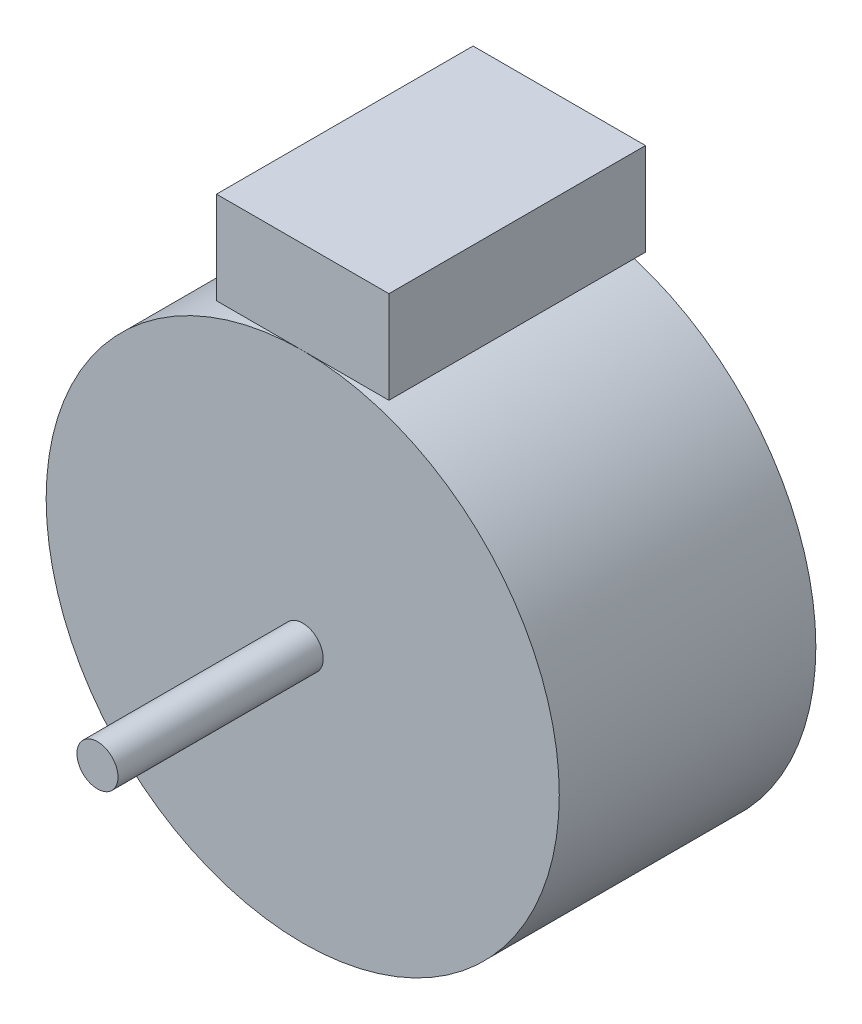
ISO-10303-21;
HEADER;
FILE_DESCRIPTION(('STEP AP214'),'2;1');
FILE_NAME('part.step','',(''),(''),'','','');
FILE_SCHEMA(('AUTOMOTIVE_DESIGN { 1 0 10303 214 1 1 1 1 }'));
ENDSEC;
DATA;
#1=APPLICATION_CONTEXT('core data for automotive mechanical design processes');
#2=APPLICATION_PROTOCOL_DEFINITION('international standard','automotive_design',2000,#1);
#3=PRODUCT_CONTEXT('',#1,'mechanical');
#4=PRODUCT('Part','Part','',(#3));
#5=PRODUCT_RELATED_PRODUCT_CATEGORY('part','',(#4));
#6=PRODUCT_DEFINITION_FORMATION('','',#4);
#7=PRODUCT_DEFINITION_CONTEXT('part definition',#1,'design');
#8=PRODUCT_DEFINITION('design','',#6,#7);
#9=PRODUCT_DEFINITION_SHAPE('','',#8);
#10=(LENGTH_UNIT() NAMED_UNIT(*) SI_UNIT(.MILLI.,.METRE.));
#11=(NAMED_UNIT(*) PLANE_ANGLE_UNIT() SI_UNIT($,.RADIAN.));
#12=(NAMED_UNIT(*) SI_UNIT($,.STERADIAN.) SOLID_ANGLE_UNIT());
#13=UNCERTAINTY_MEASURE_WITH_UNIT(LENGTH_MEASURE(1.E-05),#10,'distance_accuracy_value','');
#14=(GEOMETRIC_REPRESENTATION_CONTEXT(3) GLOBAL_UNCERTAINTY_ASSIGNED_CONTEXT((#13)) GLOBAL_UNIT_ASSIGNED_CONTEXT((#10,
#11,#12)) REPRESENTATION_CONTEXT('',''));
#15=CARTESIAN_POINT('',(0.,0.,0.));
#16=DIRECTION('',(0.,0.,1.));
#17=DIRECTION('',(1.,0.,0.));
#18=AXIS2_PLACEMENT_3D('',#15,#16,#17);
#19=CARTESIAN_POINT('',(4.2,12.5,6.25000000000001));
#20=DIRECTION('',(0.,0.,-1.));
#21=DIRECTION('',(-1.,0.,0.));
#22=AXIS2_PLACEMENT_3D('',#19,#20,#21);
#23=PLANE('',#22);
#24=DIRECTION('',(0.,-1.,0.));
#25=VECTOR('',#24,1.);
#26=CARTESIAN_POINT('',(-4.2,12.5,6.25000000000001));
#27=LINE('',#26,#25);
#28=CARTESIAN_POINT('',(-4.2,17.,6.25000000000001));
#29=VERTEX_POINT('',#28);
#30=CARTESIAN_POINT('',(-4.2,12.5,6.25000000000001));
#31=VERTEX_POINT('',#30);
#32=EDGE_CURVE('E104',#29,#31,#27,.T.);
#33=ORIENTED_EDGE('',*,*,#32,.T.);
#34=DIRECTION('',(-1.,0.,0.));
#35=VECTOR('',#34,1.);
#36=CARTESIAN_POINT('',(4.2,12.5,6.25000000000001));
#37=LINE('',#36,#35);
#38=CARTESIAN_POINT('',(4.2,12.5,6.25000000000001));
#39=VERTEX_POINT('',#38);
#40=EDGE_CURVE('E12',#39,#31,#37,.T.);
#41=ORIENTED_EDGE('',*,*,#40,.F.);
#42=DIRECTION('',(0.,-1.,0.));
#43=VECTOR('',#42,1.);
#44=CARTESIAN_POINT('',(4.2,12.5,6.25000000000001));
#45=LINE('',#44,#43);
#46=CARTESIAN_POINT('',(4.2,17.,6.25000000000001));
#47=VERTEX_POINT('',#46);
#48=EDGE_CURVE('E92',#47,#39,#45,.T.);
#49=ORIENTED_EDGE('',*,*,#48,.F.);
#50=DIRECTION('',(-1.,0.,0.));
#51=VECTOR('',#50,1.);
#52=CARTESIAN_POINT('',(4.2,17.,6.25000000000001));
#53=LINE('',#52,#51);
#54=EDGE_CURVE('E100',#47,#29,#53,.T.);
#55=ORIENTED_EDGE('',*,*,#54,.T.);
#56=EDGE_LOOP('',(#33,#41,#49,#55));
#57=FACE_BOUND('',#56,.T.);
#58=ADVANCED_FACE('F41',(#57),#23,.F.);
#59=CARTESIAN_POINT('',(4.2,12.5,6.25000000000001));
#60=DIRECTION('',(0.,1.,0.));
#61=DIRECTION('',(0.,0.,1.));
#62=AXIS2_PLACEMENT_3D('',#59,#60,#61);
#63=PLANE('',#62);
#64=DIRECTION('',(0.,0.,-1.));
#65=VECTOR('',#64,1.);
#66=CARTESIAN_POINT('',(-4.2,12.5,6.25000000000001));
#67=LINE('',#66,#65);
#68=CARTESIAN_POINT('',(-4.2,12.5,-6.25000000000001));
#69=VERTEX_POINT('',#68);
#70=EDGE_CURVE('E96',#31,#69,#67,.T.);
#71=ORIENTED_EDGE('',*,*,#70,.T.);
#72=DIRECTION('',(-1.,0.,0.));
#73=VECTOR('',#72,1.);
#74=CARTESIAN_POINT('',(4.2,12.5,-6.25000000000001));
#75=LINE('',#74,#73);
#76=CARTESIAN_POINT('',(4.2,12.5,-6.25000000000001));
#77=VERTEX_POINT('',#76);
#78=EDGE_CURVE('E49',#77,#69,#75,.T.);
#79=ORIENTED_EDGE('',*,*,#78,.F.);
#80=DIRECTION('',(0.,0.,-1.));
#81=VECTOR('',#80,1.);
#82=CARTESIAN_POINT('',(4.2,12.5,6.25000000000001));
#83=LINE('',#82,#81);
#84=EDGE_CURVE('E87',#39,#77,#83,.T.);
#85=ORIENTED_EDGE('',*,*,#84,.F.);
#86=ORIENTED_EDGE('',*,*,#40,.T.);
#87=EDGE_LOOP('',(#71,#79,#85,#86));
#88=FACE_BOUND('',#87,.T.);
#89=ADVANCED_FACE('F95',(#88),#63,.F.);
#90=CARTESIAN_POINT('',(4.2,12.5,-6.25000000000001));
#91=DIRECTION('',(0.,0.,1.));
#92=DIRECTION('',(1.,0.,0.));
#93=AXIS2_PLACEMENT_3D('',#90,#91,#92);
#94=PLANE('',#93);
#95=DIRECTION('',(0.,1.,0.));
#96=VECTOR('',#95,1.);
#97=CARTESIAN_POINT('',(-4.2,12.5,-6.25000000000001));
#98=LINE('',#97,#96);
#99=CARTESIAN_POINT('',(-4.2,17.,-6.25000000000001));
#100=VERTEX_POINT('',#99);
#101=EDGE_CURVE('E74',#69,#100,#98,.T.);
#102=ORIENTED_EDGE('',*,*,#101,.T.);
#103=DIRECTION('',(-1.,0.,0.));
#104=VECTOR('',#103,1.);
#105=CARTESIAN_POINT('',(4.2,17.,-6.25000000000001));
#106=LINE('',#105,#104);
#107=CARTESIAN_POINT('',(4.2,17.,-6.25000000000001));
#108=VERTEX_POINT('',#107);
#109=EDGE_CURVE('E97',#108,#100,#106,.T.);
#110=ORIENTED_EDGE('',*,*,#109,.F.);
#111=DIRECTION('',(0.,1.,0.));
#112=VECTOR('',#111,1.);
#113=CARTESIAN_POINT('',(4.2,12.5,-6.25000000000001));
#114=LINE('',#113,#112);
#115=EDGE_CURVE('E90',#77,#108,#114,.T.);
#116=ORIENTED_EDGE('',*,*,#115,.F.);
#117=ORIENTED_EDGE('',*,*,#78,.T.);
#118=EDGE_LOOP('',(#102,#110,#116,#117));
#119=FACE_BOUND('',#118,.T.);
#120=ADVANCED_FACE('F98',(#119),#94,.F.);
#121=CARTESIAN_POINT('',(4.2,17.,6.25000000000001));
#122=DIRECTION('',(0.,-1.,0.));
#123=DIRECTION('',(0.,0.,-1.));
#124=AXIS2_PLACEMENT_3D('',#121,#122,#123);
#125=PLANE('',#124);
#126=DIRECTION('',(0.,0.,1.));
#127=VECTOR('',#126,1.);
#128=CARTESIAN_POINT('',(-4.2,17.,6.25000000000001));
#129=LINE('',#128,#127);
#130=EDGE_CURVE('E80',#100,#29,#129,.T.);
#131=ORIENTED_EDGE('',*,*,#130,.T.);
#132=ORIENTED_EDGE('',*,*,#54,.F.);
#133=DIRECTION('',(0.,0.,1.));
#134=VECTOR('',#133,1.);
#135=CARTESIAN_POINT('',(4.2,17.,6.25000000000001));
#136=LINE('',#135,#134);
#137=EDGE_CURVE('E57',#108,#47,#136,.T.);
#138=ORIENTED_EDGE('',*,*,#137,.F.);
#139=ORIENTED_EDGE('',*,*,#109,.T.);
#140=EDGE_LOOP('',(#131,#132,#138,#139));
#141=FACE_BOUND('',#140,.T.);
#142=ADVANCED_FACE('F111',(#141),#125,.F.);
#143=CARTESIAN_POINT('',(4.2,0.,0.));
#144=DIRECTION('',(-1.,0.,0.));
#145=DIRECTION('',(0.,0.,1.));
#146=AXIS2_PLACEMENT_3D('',#143,#144,#145);
#147=PLANE('',#146);
#148=ORIENTED_EDGE('',*,*,#48,.T.);
#149=ORIENTED_EDGE('',*,*,#84,.T.);
#150=ORIENTED_EDGE('',*,*,#115,.T.);
#151=ORIENTED_EDGE('',*,*,#137,.T.);
#152=EDGE_LOOP('',(#148,#149,#150,#151));
#153=FACE_BOUND('',#152,.T.);
#154=ADVANCED_FACE('F88',(#153),#147,.F.);
#155=CARTESIAN_POINT('',(-4.2,0.,0.));
#156=DIRECTION('',(-1.,0.,0.));
#157=DIRECTION('',(0.,0.,1.));
#158=AXIS2_PLACEMENT_3D('',#155,#156,#157);
#159=PLANE('',#158);
#160=ORIENTED_EDGE('',*,*,#32,.F.);
#161=ORIENTED_EDGE('',*,*,#130,.F.);
#162=ORIENTED_EDGE('',*,*,#101,.F.);
#163=ORIENTED_EDGE('',*,*,#70,.F.);
#164=EDGE_LOOP('',(#160,#161,#162,#163));
#165=FACE_BOUND('',#164,.T.);
#166=ADVANCED_FACE('F114',(#165),#159,.T.);
#167=CLOSED_SHELL('',(#58,#89,#120,#142,#154,#166));
#168=MANIFOLD_SOLID_BREP('B2',#167);
#169=CARTESIAN_POINT('',(0.,0.,16.25));
#170=DIRECTION('',(0.,0.,1.));
#171=DIRECTION('',(0.,-1.,0.));
#172=AXIS2_PLACEMENT_3D('',#169,#170,#171);
#173=PLANE('',#172);
#174=CARTESIAN_POINT('',(0.,0.,16.25));
#175=DIRECTION('',(0.,0.,1.));
#176=DIRECTION('',(0.,-1.,0.));
#177=AXIS2_PLACEMENT_3D('',#174,#175,#176);
#178=CIRCLE('',#177,1.00000000000001);
#179=CARTESIAN_POINT('',(0.,-1.,16.25));
#180=VERTEX_POINT('',#179);
#181=EDGE_CURVE('E40',#180,#180,#178,.T.);
#182=ORIENTED_EDGE('',*,*,#181,.T.);
#183=EDGE_LOOP('',(#182));
#184=FACE_BOUND('',#183,.T.);
#185=ADVANCED_FACE('F165',(#184),#173,.T.);
#186=CARTESIAN_POINT('',(0.,0.,38.7864086243864));
#187=DIRECTION('',(0.,0.,1.));
#188=DIRECTION('',(0.,-1.,0.));
#189=AXIS2_PLACEMENT_3D('',#186,#187,#188);
#190=CYLINDRICAL_SURFACE('',#189,1.00000000000001);
#191=CARTESIAN_POINT('',(0.,0.,6.25));
#192=DIRECTION('',(0.,0.,1.));
#193=DIRECTION('',(0.,-1.,0.));
#194=AXIS2_PLACEMENT_3D('',#191,#192,#193);
#195=CIRCLE('',#194,1.00000000000001);
#196=CARTESIAN_POINT('',(0.,-1.,6.25));
#197=VERTEX_POINT('',#196);
#198=EDGE_CURVE('E171',#197,#197,#195,.T.);
#199=ORIENTED_EDGE('',*,*,#198,.T.);
#200=EDGE_LOOP('',(#199));
#201=FACE_BOUND('',#200,.T.);
#202=ORIENTED_EDGE('',*,*,#181,.F.);
#203=EDGE_LOOP('',(#202));
#204=FACE_BOUND('',#203,.T.);
#205=ADVANCED_FACE('F197',(#201,#204),#190,.T.);
#206=CARTESIAN_POINT('',(0.,-1.,6.25));
#207=DIRECTION('',(0.,0.,1.));
#208=DIRECTION('',(0.,-1.,0.));
#209=AXIS2_PLACEMENT_3D('',#206,#207,#208);
#210=PLANE('',#209);
#211=CARTESIAN_POINT('',(0.,0.,6.25));
#212=DIRECTION('',(0.,0.,1.));
#213=DIRECTION('',(0.,-1.,0.));
#214=AXIS2_PLACEMENT_3D('',#211,#212,#213);
#215=CIRCLE('',#214,12.5);
#216=CARTESIAN_POINT('',(0.,-12.5,6.25));
#217=VERTEX_POINT('',#216);
#218=EDGE_CURVE('E175',#217,#217,#215,.T.);
#219=ORIENTED_EDGE('',*,*,#218,.T.);
#220=EDGE_LOOP('',(#219));
#221=FACE_BOUND('',#220,.T.);
#222=ORIENTED_EDGE('',*,*,#198,.F.);
#223=EDGE_LOOP('',(#222));
#224=FACE_BOUND('',#223,.T.);
#225=ADVANCED_FACE('F194',(#221,#224),#210,.T.);
#226=CARTESIAN_POINT('',(0.,0.,38.7864086243864));
#227=DIRECTION('',(0.,0.,1.));
#228=DIRECTION('',(0.,-1.,0.));
#229=AXIS2_PLACEMENT_3D('',#226,#227,#228);
#230=CYLINDRICAL_SURFACE('',#229,12.5);
#231=CARTESIAN_POINT('',(0.,0.,-6.25000000000001));
#232=DIRECTION('',(0.,0.,1.));
#233=DIRECTION('',(0.,-1.,0.));
#234=AXIS2_PLACEMENT_3D('',#231,#232,#233);
#235=CIRCLE('',#234,12.5);
#236=CARTESIAN_POINT('',(0.,-12.5,-6.25000000000001));
#237=VERTEX_POINT('',#236);
#238=EDGE_CURVE('E179',#237,#237,#235,.T.);
#239=ORIENTED_EDGE('',*,*,#238,.T.);
#240=EDGE_LOOP('',(#239));
#241=FACE_BOUND('',#240,.T.);
#242=ORIENTED_EDGE('',*,*,#218,.F.);
#243=EDGE_LOOP('',(#242));
#244=FACE_BOUND('',#243,.T.);
#245=ADVANCED_FACE('F185',(#241,#244),#230,.T.);
#246=CARTESIAN_POINT('',(0.,0.,-6.25));
#247=DIRECTION('',(0.,0.,-1.));
#248=DIRECTION('',(0.,1.,0.));
#249=AXIS2_PLACEMENT_3D('',#246,#247,#248);
#250=PLANE('',#249);
#251=ORIENTED_EDGE('',*,*,#238,.F.);
#252=EDGE_LOOP('',(#251));
#253=FACE_BOUND('',#252,.T.);
#254=ADVANCED_FACE('F188',(#253),#250,.T.);
#255=CLOSED_SHELL('',(#185,#205,#225,#245,#254));
#256=MANIFOLD_SOLID_BREP('B6',#255);
#257=ADVANCED_BREP_SHAPE_REPRESENTATION('',(#18,#168,#256),#14);
#258=SHAPE_DEFINITION_REPRESENTATION(#9,#257);
ENDSEC;
END-ISO-10303-21;
